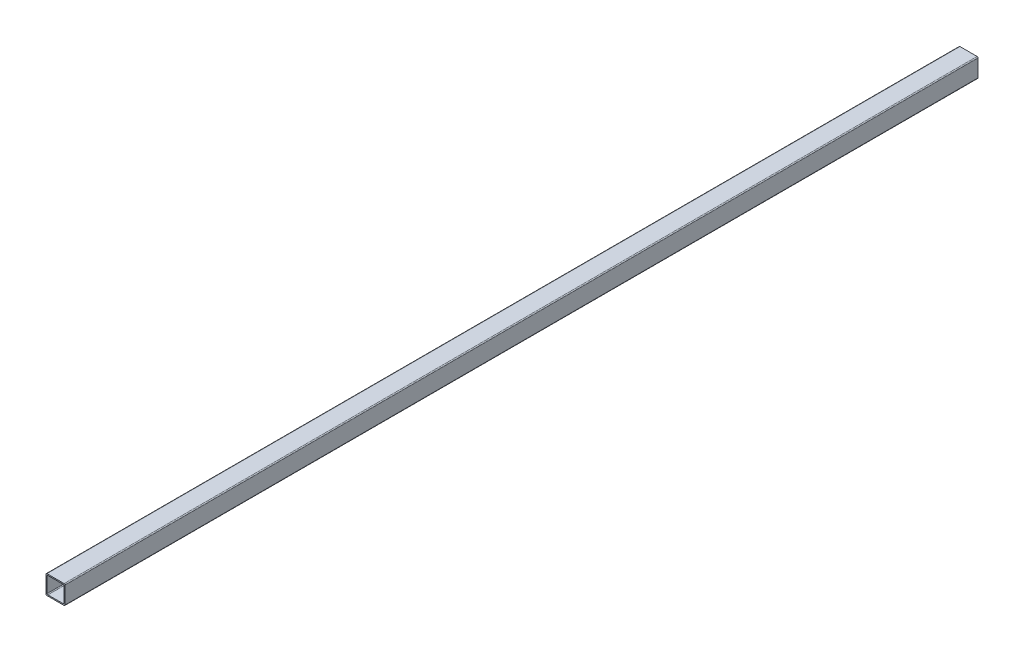
ISO-10303-21;
HEADER;
FILE_DESCRIPTION(('STEP AP214'),'2;1');
FILE_NAME('part.step','',(''),(''),'','','');
FILE_SCHEMA(('AUTOMOTIVE_DESIGN { 1 0 10303 214 1 1 1 1 }'));
ENDSEC;
DATA;
#1=APPLICATION_CONTEXT('core data for automotive mechanical design processes');
#2=APPLICATION_PROTOCOL_DEFINITION('international standard','automotive_design',2000,#1);
#3=PRODUCT_CONTEXT('',#1,'mechanical');
#4=PRODUCT('Part','Part','',(#3));
#5=PRODUCT_RELATED_PRODUCT_CATEGORY('part','',(#4));
#6=PRODUCT_DEFINITION_FORMATION('','',#4);
#7=PRODUCT_DEFINITION_CONTEXT('part definition',#1,'design');
#8=PRODUCT_DEFINITION('design','',#6,#7);
#9=PRODUCT_DEFINITION_SHAPE('','',#8);
#10=(LENGTH_UNIT() NAMED_UNIT(*) SI_UNIT(.MILLI.,.METRE.));
#11=(NAMED_UNIT(*) PLANE_ANGLE_UNIT() SI_UNIT($,.RADIAN.));
#12=(NAMED_UNIT(*) SI_UNIT($,.STERADIAN.) SOLID_ANGLE_UNIT());
#13=UNCERTAINTY_MEASURE_WITH_UNIT(LENGTH_MEASURE(1.E-05),#10,'distance_accuracy_value','');
#14=(GEOMETRIC_REPRESENTATION_CONTEXT(3) GLOBAL_UNCERTAINTY_ASSIGNED_CONTEXT((#13)) GLOBAL_UNIT_ASSIGNED_CONTEXT((#10,
#11,#12)) REPRESENTATION_CONTEXT('',''));
#15=CARTESIAN_POINT('',(0.,0.,0.));
#16=DIRECTION('',(0.,0.,1.));
#17=DIRECTION('',(1.,0.,0.));
#18=AXIS2_PLACEMENT_3D('',#15,#16,#17);
#19=CARTESIAN_POINT('',(22.86,-22.86,1219.2));
#20=DIRECTION('',(0.,0.,1.));
#21=DIRECTION('',(1.,0.,0.));
#22=AXIS2_PLACEMENT_3D('',#19,#20,#21);
#23=PLANE('',#22);
#24=CARTESIAN_POINT('',(22.86,-22.86,1219.2));
#25=DIRECTION('',(0.,0.,1.));
#26=DIRECTION('',(1.,0.,0.));
#27=AXIS2_PLACEMENT_3D('',#24,#25,#26);
#28=CIRCLE('',#27,2.54);
#29=CARTESIAN_POINT('',(22.86,-25.4,1219.2));
#30=VERTEX_POINT('',#29);
#31=CARTESIAN_POINT('',(25.4,-22.86,1219.2));
#32=VERTEX_POINT('',#31);
#33=EDGE_CURVE('E140',#30,#32,#28,.T.);
#34=ORIENTED_EDGE('',*,*,#33,.T.);
#35=DIRECTION('',(0.,1.,0.));
#36=VECTOR('',#35,1.);
#37=CARTESIAN_POINT('',(25.4,-22.86,1219.2));
#38=LINE('',#37,#36);
#39=CARTESIAN_POINT('',(25.4,22.86,1219.2));
#40=VERTEX_POINT('',#39);
#41=EDGE_CURVE('E223',#32,#40,#38,.T.);
#42=ORIENTED_EDGE('',*,*,#41,.T.);
#43=CARTESIAN_POINT('',(22.86,22.86,1219.2));
#44=DIRECTION('',(0.,0.,1.));
#45=DIRECTION('',(1.,0.,0.));
#46=AXIS2_PLACEMENT_3D('',#43,#44,#45);
#47=CIRCLE('',#46,2.54);
#48=CARTESIAN_POINT('',(22.86,25.4,1219.2));
#49=VERTEX_POINT('',#48);
#50=EDGE_CURVE('E225',#40,#49,#47,.T.);
#51=ORIENTED_EDGE('',*,*,#50,.T.);
#52=DIRECTION('',(-1.,0.,0.));
#53=VECTOR('',#52,1.);
#54=CARTESIAN_POINT('',(22.86,25.4,1219.2));
#55=LINE('',#54,#53);
#56=CARTESIAN_POINT('',(-22.86,25.4,1219.2));
#57=VERTEX_POINT('',#56);
#58=EDGE_CURVE('E227',#49,#57,#55,.T.);
#59=ORIENTED_EDGE('',*,*,#58,.T.);
#60=CARTESIAN_POINT('',(-22.86,22.86,1219.2));
#61=DIRECTION('',(0.,0.,1.));
#62=DIRECTION('',(1.,0.,0.));
#63=AXIS2_PLACEMENT_3D('',#60,#61,#62);
#64=CIRCLE('',#63,2.54);
#65=CARTESIAN_POINT('',(-25.4,22.86,1219.2));
#66=VERTEX_POINT('',#65);
#67=EDGE_CURVE('E229',#57,#66,#64,.T.);
#68=ORIENTED_EDGE('',*,*,#67,.T.);
#69=DIRECTION('',(0.,-1.,0.));
#70=VECTOR('',#69,1.);
#71=CARTESIAN_POINT('',(-25.4,-22.86,1219.2));
#72=LINE('',#71,#70);
#73=CARTESIAN_POINT('',(-25.4,-22.86,1219.2));
#74=VERTEX_POINT('',#73);
#75=EDGE_CURVE('E231',#66,#74,#72,.T.);
#76=ORIENTED_EDGE('',*,*,#75,.T.);
#77=CARTESIAN_POINT('',(-22.86,-22.86,1219.2));
#78=DIRECTION('',(0.,0.,1.));
#79=DIRECTION('',(1.,0.,0.));
#80=AXIS2_PLACEMENT_3D('',#77,#78,#79);
#81=CIRCLE('',#80,2.54);
#82=CARTESIAN_POINT('',(-22.86,-25.4,1219.2));
#83=VERTEX_POINT('',#82);
#84=EDGE_CURVE('E233',#74,#83,#81,.T.);
#85=ORIENTED_EDGE('',*,*,#84,.T.);
#86=DIRECTION('',(1.,0.,0.));
#87=VECTOR('',#86,1.);
#88=CARTESIAN_POINT('',(22.86,-25.4,1219.2));
#89=LINE('',#88,#87);
#90=EDGE_CURVE('E39',#83,#30,#89,.T.);
#91=ORIENTED_EDGE('',*,*,#90,.T.);
#92=EDGE_LOOP('',(#34,#42,#51,#59,#68,#76,#85,#91));
#93=FACE_BOUND('',#92,.T.);
#94=DIRECTION('',(-1.,0.,0.));
#95=VECTOR('',#94,1.);
#96=CARTESIAN_POINT('',(20.1168,22.352,1219.2));
#97=LINE('',#96,#95);
#98=CARTESIAN_POINT('',(20.1168,22.352,1219.2));
#99=VERTEX_POINT('',#98);
#100=CARTESIAN_POINT('',(-20.1168,22.352,1219.2));
#101=VERTEX_POINT('',#100);
#102=EDGE_CURVE('E196',#99,#101,#97,.T.);
#103=ORIENTED_EDGE('',*,*,#102,.F.);
#104=CARTESIAN_POINT('',(20.1168,20.1168,1219.2));
#105=DIRECTION('',(0.,0.,1.));
#106=DIRECTION('',(1.,0.,0.));
#107=AXIS2_PLACEMENT_3D('',#104,#105,#106);
#108=CIRCLE('',#107,2.2352);
#109=CARTESIAN_POINT('',(22.352,20.1168,1219.2));
#110=VERTEX_POINT('',#109);
#111=EDGE_CURVE('E137',#110,#99,#108,.T.);
#112=ORIENTED_EDGE('',*,*,#111,.F.);
#113=DIRECTION('',(0.,1.,0.));
#114=VECTOR('',#113,1.);
#115=CARTESIAN_POINT('',(22.352,20.1168,1219.2));
#116=LINE('',#115,#114);
#117=CARTESIAN_POINT('',(22.352,-20.1168,1219.2));
#118=VERTEX_POINT('',#117);
#119=EDGE_CURVE('E208',#118,#110,#116,.T.);
#120=ORIENTED_EDGE('',*,*,#119,.F.);
#121=CARTESIAN_POINT('',(20.1168,-20.1168,1219.2));
#122=DIRECTION('',(0.,0.,1.));
#123=DIRECTION('',(1.,0.,0.));
#124=AXIS2_PLACEMENT_3D('',#121,#122,#123);
#125=CIRCLE('',#124,2.2352);
#126=CARTESIAN_POINT('',(20.1168,-22.352,1219.2));
#127=VERTEX_POINT('',#126);
#128=EDGE_CURVE('E206',#127,#118,#125,.T.);
#129=ORIENTED_EDGE('',*,*,#128,.F.);
#130=DIRECTION('',(1.,0.,0.));
#131=VECTOR('',#130,1.);
#132=CARTESIAN_POINT('',(20.1168,-22.352,1219.2));
#133=LINE('',#132,#131);
#134=CARTESIAN_POINT('',(-20.1168,-22.352,1219.2));
#135=VERTEX_POINT('',#134);
#136=EDGE_CURVE('E204',#135,#127,#133,.T.);
#137=ORIENTED_EDGE('',*,*,#136,.F.);
#138=CARTESIAN_POINT('',(-20.1168,-20.1168,1219.2));
#139=DIRECTION('',(0.,0.,1.));
#140=DIRECTION('',(1.,0.,0.));
#141=AXIS2_PLACEMENT_3D('',#138,#139,#140);
#142=CIRCLE('',#141,2.2352);
#143=CARTESIAN_POINT('',(-22.352,-20.1168,1219.2));
#144=VERTEX_POINT('',#143);
#145=EDGE_CURVE('E202',#144,#135,#142,.T.);
#146=ORIENTED_EDGE('',*,*,#145,.F.);
#147=DIRECTION('',(0.,-1.,0.));
#148=VECTOR('',#147,1.);
#149=CARTESIAN_POINT('',(-22.352,20.1168,1219.2));
#150=LINE('',#149,#148);
#151=CARTESIAN_POINT('',(-22.352,20.1168,1219.2));
#152=VERTEX_POINT('',#151);
#153=EDGE_CURVE('E200',#152,#144,#150,.T.);
#154=ORIENTED_EDGE('',*,*,#153,.F.);
#155=CARTESIAN_POINT('',(-20.1168,20.1168,1219.2));
#156=DIRECTION('',(0.,0.,1.));
#157=DIRECTION('',(1.,0.,0.));
#158=AXIS2_PLACEMENT_3D('',#155,#156,#157);
#159=CIRCLE('',#158,2.2352);
#160=EDGE_CURVE('E198',#101,#152,#159,.T.);
#161=ORIENTED_EDGE('',*,*,#160,.F.);
#162=EDGE_LOOP('',(#103,#112,#120,#129,#137,#146,#154,#161));
#163=FACE_BOUND('',#162,.T.);
#164=ADVANCED_FACE('F16',(#93,#163),#23,.T.);
#165=CARTESIAN_POINT('',(22.86,-22.86,1219.2));
#166=DIRECTION('',(0.,0.,-1.));
#167=DIRECTION('',(-1.,0.,0.));
#168=AXIS2_PLACEMENT_3D('',#165,#166,#167);
#169=CYLINDRICAL_SURFACE('',#168,2.54);
#170=DIRECTION('',(0.,0.,-1.));
#171=VECTOR('',#170,1.);
#172=CARTESIAN_POINT('',(22.86,-25.4,1219.2));
#173=LINE('',#172,#171);
#174=CARTESIAN_POINT('',(22.86,-25.4,-1219.2));
#175=VERTEX_POINT('',#174);
#176=EDGE_CURVE('E236',#30,#175,#173,.T.);
#177=ORIENTED_EDGE('',*,*,#176,.T.);
#178=CARTESIAN_POINT('',(22.86,-22.86,-1219.2));
#179=DIRECTION('',(0.,0.,1.));
#180=DIRECTION('',(1.,0.,0.));
#181=AXIS2_PLACEMENT_3D('',#178,#179,#180);
#182=CIRCLE('',#181,2.54);
#183=CARTESIAN_POINT('',(25.4,-22.86,-1219.2));
#184=VERTEX_POINT('',#183);
#185=EDGE_CURVE('E171',#175,#184,#182,.T.);
#186=ORIENTED_EDGE('',*,*,#185,.T.);
#187=DIRECTION('',(0.,0.,-1.));
#188=VECTOR('',#187,1.);
#189=CARTESIAN_POINT('',(25.4,-22.86,1219.2));
#190=LINE('',#189,#188);
#191=EDGE_CURVE('E11',#32,#184,#190,.T.);
#192=ORIENTED_EDGE('',*,*,#191,.F.);
#193=ORIENTED_EDGE('',*,*,#33,.F.);
#194=EDGE_LOOP('',(#177,#186,#192,#193));
#195=FACE_BOUND('',#194,.T.);
#196=ADVANCED_FACE('F18',(#195),#169,.T.);
#197=CARTESIAN_POINT('',(25.4,-22.86,1219.2));
#198=DIRECTION('',(-1.,0.,0.));
#199=DIRECTION('',(0.,0.,1.));
#200=AXIS2_PLACEMENT_3D('',#197,#198,#199);
#201=PLANE('',#200);
#202=ORIENTED_EDGE('',*,*,#191,.T.);
#203=DIRECTION('',(0.,1.,0.));
#204=VECTOR('',#203,1.);
#205=CARTESIAN_POINT('',(25.4,-22.86,-1219.2));
#206=LINE('',#205,#204);
#207=CARTESIAN_POINT('',(25.4,22.86,-1219.2));
#208=VERTEX_POINT('',#207);
#209=EDGE_CURVE('E174',#184,#208,#206,.T.);
#210=ORIENTED_EDGE('',*,*,#209,.T.);
#211=DIRECTION('',(0.,0.,-1.));
#212=VECTOR('',#211,1.);
#213=CARTESIAN_POINT('',(25.4,22.86,1219.2));
#214=LINE('',#213,#212);
#215=EDGE_CURVE('E24',#40,#208,#214,.T.);
#216=ORIENTED_EDGE('',*,*,#215,.F.);
#217=ORIENTED_EDGE('',*,*,#41,.F.);
#218=EDGE_LOOP('',(#202,#210,#216,#217));
#219=FACE_BOUND('',#218,.T.);
#220=ADVANCED_FACE('F258',(#219),#201,.F.);
#221=CARTESIAN_POINT('',(22.86,22.86,1219.2));
#222=DIRECTION('',(0.,0.,-1.));
#223=DIRECTION('',(-1.,0.,0.));
#224=AXIS2_PLACEMENT_3D('',#221,#222,#223);
#225=CYLINDRICAL_SURFACE('',#224,2.54);
#226=ORIENTED_EDGE('',*,*,#215,.T.);
#227=CARTESIAN_POINT('',(22.86,22.86,-1219.2));
#228=DIRECTION('',(0.,0.,1.));
#229=DIRECTION('',(1.,0.,0.));
#230=AXIS2_PLACEMENT_3D('',#227,#228,#229);
#231=CIRCLE('',#230,2.54);
#232=CARTESIAN_POINT('',(22.86,25.4,-1219.2));
#233=VERTEX_POINT('',#232);
#234=EDGE_CURVE('E177',#208,#233,#231,.T.);
#235=ORIENTED_EDGE('',*,*,#234,.T.);
#236=DIRECTION('',(0.,0.,-1.));
#237=VECTOR('',#236,1.);
#238=CARTESIAN_POINT('',(22.86,25.4,1219.2));
#239=LINE('',#238,#237);
#240=EDGE_CURVE('E246',#49,#233,#239,.T.);
#241=ORIENTED_EDGE('',*,*,#240,.F.);
#242=ORIENTED_EDGE('',*,*,#50,.F.);
#243=EDGE_LOOP('',(#226,#235,#241,#242));
#244=FACE_BOUND('',#243,.T.);
#245=ADVANCED_FACE('F251',(#244),#225,.T.);
#246=CARTESIAN_POINT('',(22.86,25.4,1219.2));
#247=DIRECTION('',(0.,-1.,0.));
#248=DIRECTION('',(1.,0.,0.));
#249=AXIS2_PLACEMENT_3D('',#246,#247,#248);
#250=PLANE('',#249);
#251=ORIENTED_EDGE('',*,*,#240,.T.);
#252=DIRECTION('',(-1.,0.,0.));
#253=VECTOR('',#252,1.);
#254=CARTESIAN_POINT('',(22.86,25.4,-1219.2));
#255=LINE('',#254,#253);
#256=CARTESIAN_POINT('',(-22.86,25.4,-1219.2));
#257=VERTEX_POINT('',#256);
#258=EDGE_CURVE('E180',#233,#257,#255,.T.);
#259=ORIENTED_EDGE('',*,*,#258,.T.);
#260=DIRECTION('',(0.,0.,-1.));
#261=VECTOR('',#260,1.);
#262=CARTESIAN_POINT('',(-22.86,25.4,1219.2));
#263=LINE('',#262,#261);
#264=EDGE_CURVE('E244',#57,#257,#263,.T.);
#265=ORIENTED_EDGE('',*,*,#264,.F.);
#266=ORIENTED_EDGE('',*,*,#58,.F.);
#267=EDGE_LOOP('',(#251,#259,#265,#266));
#268=FACE_BOUND('',#267,.T.);
#269=ADVANCED_FACE('F281',(#268),#250,.F.);
#270=CARTESIAN_POINT('',(-22.86,22.86,1219.2));
#271=DIRECTION('',(0.,0.,-1.));
#272=DIRECTION('',(-1.,0.,0.));
#273=AXIS2_PLACEMENT_3D('',#270,#271,#272);
#274=CYLINDRICAL_SURFACE('',#273,2.54);
#275=ORIENTED_EDGE('',*,*,#264,.T.);
#276=CARTESIAN_POINT('',(-22.86,22.86,-1219.2));
#277=DIRECTION('',(0.,0.,1.));
#278=DIRECTION('',(1.,0.,0.));
#279=AXIS2_PLACEMENT_3D('',#276,#277,#278);
#280=CIRCLE('',#279,2.54);
#281=CARTESIAN_POINT('',(-25.4,22.86,-1219.2));
#282=VERTEX_POINT('',#281);
#283=EDGE_CURVE('E183',#257,#282,#280,.T.);
#284=ORIENTED_EDGE('',*,*,#283,.T.);
#285=DIRECTION('',(0.,0.,-1.));
#286=VECTOR('',#285,1.);
#287=CARTESIAN_POINT('',(-25.4,22.86,1219.2));
#288=LINE('',#287,#286);
#289=EDGE_CURVE('E242',#66,#282,#288,.T.);
#290=ORIENTED_EDGE('',*,*,#289,.F.);
#291=ORIENTED_EDGE('',*,*,#67,.F.);
#292=EDGE_LOOP('',(#275,#284,#290,#291));
#293=FACE_BOUND('',#292,.T.);
#294=ADVANCED_FACE('F278',(#293),#274,.T.);
#295=CARTESIAN_POINT('',(-25.4,-22.86,1219.2));
#296=DIRECTION('',(1.,0.,0.));
#297=DIRECTION('',(0.,0.,-1.));
#298=AXIS2_PLACEMENT_3D('',#295,#296,#297);
#299=PLANE('',#298);
#300=ORIENTED_EDGE('',*,*,#289,.T.);
#301=DIRECTION('',(0.,-1.,0.));
#302=VECTOR('',#301,1.);
#303=CARTESIAN_POINT('',(-25.4,-22.86,-1219.2));
#304=LINE('',#303,#302);
#305=CARTESIAN_POINT('',(-25.4,-22.86,-1219.2));
#306=VERTEX_POINT('',#305);
#307=EDGE_CURVE('E186',#282,#306,#304,.T.);
#308=ORIENTED_EDGE('',*,*,#307,.T.);
#309=DIRECTION('',(0.,0.,-1.));
#310=VECTOR('',#309,1.);
#311=CARTESIAN_POINT('',(-25.4,-22.86,1219.2));
#312=LINE('',#311,#310);
#313=EDGE_CURVE('E240',#74,#306,#312,.T.);
#314=ORIENTED_EDGE('',*,*,#313,.F.);
#315=ORIENTED_EDGE('',*,*,#75,.F.);
#316=EDGE_LOOP('',(#300,#308,#314,#315));
#317=FACE_BOUND('',#316,.T.);
#318=ADVANCED_FACE('F273',(#317),#299,.F.);
#319=CARTESIAN_POINT('',(-22.86,-22.86,1219.2));
#320=DIRECTION('',(0.,0.,-1.));
#321=DIRECTION('',(-1.,0.,0.));
#322=AXIS2_PLACEMENT_3D('',#319,#320,#321);
#323=CYLINDRICAL_SURFACE('',#322,2.54);
#324=ORIENTED_EDGE('',*,*,#313,.T.);
#325=CARTESIAN_POINT('',(-22.86,-22.86,-1219.2));
#326=DIRECTION('',(0.,0.,1.));
#327=DIRECTION('',(1.,0.,0.));
#328=AXIS2_PLACEMENT_3D('',#325,#326,#327);
#329=CIRCLE('',#328,2.54);
#330=CARTESIAN_POINT('',(-22.86,-25.4,-1219.2));
#331=VERTEX_POINT('',#330);
#332=EDGE_CURVE('E189',#306,#331,#329,.T.);
#333=ORIENTED_EDGE('',*,*,#332,.T.);
#334=DIRECTION('',(0.,0.,-1.));
#335=VECTOR('',#334,1.);
#336=CARTESIAN_POINT('',(-22.86,-25.4,1219.2));
#337=LINE('',#336,#335);
#338=EDGE_CURVE('E238',#83,#331,#337,.T.);
#339=ORIENTED_EDGE('',*,*,#338,.F.);
#340=ORIENTED_EDGE('',*,*,#84,.F.);
#341=EDGE_LOOP('',(#324,#333,#339,#340));
#342=FACE_BOUND('',#341,.T.);
#343=ADVANCED_FACE('F269',(#342),#323,.T.);
#344=CARTESIAN_POINT('',(22.86,-25.4,1219.2));
#345=DIRECTION('',(0.,1.,0.));
#346=DIRECTION('',(-1.,0.,0.));
#347=AXIS2_PLACEMENT_3D('',#344,#345,#346);
#348=PLANE('',#347);
#349=ORIENTED_EDGE('',*,*,#338,.T.);
#350=DIRECTION('',(1.,0.,0.));
#351=VECTOR('',#350,1.);
#352=CARTESIAN_POINT('',(22.86,-25.4,-1219.2));
#353=LINE('',#352,#351);
#354=EDGE_CURVE('E192',#331,#175,#353,.T.);
#355=ORIENTED_EDGE('',*,*,#354,.T.);
#356=ORIENTED_EDGE('',*,*,#176,.F.);
#357=ORIENTED_EDGE('',*,*,#90,.F.);
#358=EDGE_LOOP('',(#349,#355,#356,#357));
#359=FACE_BOUND('',#358,.T.);
#360=ADVANCED_FACE('F265',(#359),#348,.F.);
#361=CARTESIAN_POINT('',(20.1168,20.1168,1219.2));
#362=DIRECTION('',(0.,0.,-1.));
#363=DIRECTION('',(-1.,0.,0.));
#364=AXIS2_PLACEMENT_3D('',#361,#362,#363);
#365=CYLINDRICAL_SURFACE('',#364,2.2352);
#366=DIRECTION('',(0.,0.,-1.));
#367=VECTOR('',#366,1.);
#368=CARTESIAN_POINT('',(20.1168,22.352,1219.2));
#369=LINE('',#368,#367);
#370=CARTESIAN_POINT('',(20.1168,22.352,-1219.2));
#371=VERTEX_POINT('',#370);
#372=EDGE_CURVE('E129',#99,#371,#369,.T.);
#373=ORIENTED_EDGE('',*,*,#372,.T.);
#374=CARTESIAN_POINT('',(20.1168,20.1168,-1219.2));
#375=DIRECTION('',(0.,0.,1.));
#376=DIRECTION('',(1.,0.,0.));
#377=AXIS2_PLACEMENT_3D('',#374,#375,#376);
#378=CIRCLE('',#377,2.2352);
#379=CARTESIAN_POINT('',(22.352,20.1168,-1219.2));
#380=VERTEX_POINT('',#379);
#381=EDGE_CURVE('E134',#380,#371,#378,.T.);
#382=ORIENTED_EDGE('',*,*,#381,.F.);
#383=DIRECTION('',(0.,0.,-1.));
#384=VECTOR('',#383,1.);
#385=CARTESIAN_POINT('',(22.352,20.1168,1219.2));
#386=LINE('',#385,#384);
#387=EDGE_CURVE('E210',#110,#380,#386,.T.);
#388=ORIENTED_EDGE('',*,*,#387,.F.);
#389=ORIENTED_EDGE('',*,*,#111,.T.);
#390=EDGE_LOOP('',(#373,#382,#388,#389));
#391=FACE_BOUND('',#390,.T.);
#392=ADVANCED_FACE('F131',(#391),#365,.F.);
#393=CARTESIAN_POINT('',(20.1168,22.352,1219.2));
#394=DIRECTION('',(0.,-1.,0.));
#395=DIRECTION('',(0.,0.,-1.));
#396=AXIS2_PLACEMENT_3D('',#393,#394,#395);
#397=PLANE('',#396);
#398=DIRECTION('',(0.,0.,-1.));
#399=VECTOR('',#398,1.);
#400=CARTESIAN_POINT('',(-20.1168,22.352,1219.2));
#401=LINE('',#400,#399);
#402=CARTESIAN_POINT('',(-20.1168,22.352,-1219.2));
#403=VERTEX_POINT('',#402);
#404=EDGE_CURVE('E141',#101,#403,#401,.T.);
#405=ORIENTED_EDGE('',*,*,#404,.T.);
#406=DIRECTION('',(-1.,0.,0.));
#407=VECTOR('',#406,1.);
#408=CARTESIAN_POINT('',(20.1168,22.352,-1219.2));
#409=LINE('',#408,#407);
#410=EDGE_CURVE('E144',#371,#403,#409,.T.);
#411=ORIENTED_EDGE('',*,*,#410,.F.);
#412=ORIENTED_EDGE('',*,*,#372,.F.);
#413=ORIENTED_EDGE('',*,*,#102,.T.);
#414=EDGE_LOOP('',(#405,#411,#412,#413));
#415=FACE_BOUND('',#414,.T.);
#416=ADVANCED_FACE('F145',(#415),#397,.T.);
#417=CARTESIAN_POINT('',(-20.1168,20.1168,1219.2));
#418=DIRECTION('',(0.,0.,-1.));
#419=DIRECTION('',(-1.,0.,0.));
#420=AXIS2_PLACEMENT_3D('',#417,#418,#419);
#421=CYLINDRICAL_SURFACE('',#420,2.2352);
#422=DIRECTION('',(0.,0.,-1.));
#423=VECTOR('',#422,1.);
#424=CARTESIAN_POINT('',(-22.352,20.1168,1219.2));
#425=LINE('',#424,#423);
#426=CARTESIAN_POINT('',(-22.352,20.1168,-1219.2));
#427=VERTEX_POINT('',#426);
#428=EDGE_CURVE('E219',#152,#427,#425,.T.);
#429=ORIENTED_EDGE('',*,*,#428,.T.);
#430=CARTESIAN_POINT('',(-20.1168,20.1168,-1219.2));
#431=DIRECTION('',(0.,0.,1.));
#432=DIRECTION('',(1.,0.,0.));
#433=AXIS2_PLACEMENT_3D('',#430,#431,#432);
#434=CIRCLE('',#433,2.2352);
#435=EDGE_CURVE('E150',#403,#427,#434,.T.);
#436=ORIENTED_EDGE('',*,*,#435,.F.);
#437=ORIENTED_EDGE('',*,*,#404,.F.);
#438=ORIENTED_EDGE('',*,*,#160,.T.);
#439=EDGE_LOOP('',(#429,#436,#437,#438));
#440=FACE_BOUND('',#439,.T.);
#441=ADVANCED_FACE('F290',(#440),#421,.F.);
#442=CARTESIAN_POINT('',(-22.352,20.1168,1219.2));
#443=DIRECTION('',(1.,0.,0.));
#444=DIRECTION('',(0.,1.,0.));
#445=AXIS2_PLACEMENT_3D('',#442,#443,#444);
#446=PLANE('',#445);
#447=DIRECTION('',(0.,0.,-1.));
#448=VECTOR('',#447,1.);
#449=CARTESIAN_POINT('',(-22.352,-20.1168,1219.2));
#450=LINE('',#449,#448);
#451=CARTESIAN_POINT('',(-22.352,-20.1168,-1219.2));
#452=VERTEX_POINT('',#451);
#453=EDGE_CURVE('E217',#144,#452,#450,.T.);
#454=ORIENTED_EDGE('',*,*,#453,.T.);
#455=DIRECTION('',(0.,-1.,0.));
#456=VECTOR('',#455,1.);
#457=CARTESIAN_POINT('',(-22.352,20.1168,-1219.2));
#458=LINE('',#457,#456);
#459=EDGE_CURVE('E159',#427,#452,#458,.T.);
#460=ORIENTED_EDGE('',*,*,#459,.F.);
#461=ORIENTED_EDGE('',*,*,#428,.F.);
#462=ORIENTED_EDGE('',*,*,#153,.T.);
#463=EDGE_LOOP('',(#454,#460,#461,#462));
#464=FACE_BOUND('',#463,.T.);
#465=ADVANCED_FACE('F295',(#464),#446,.T.);
#466=CARTESIAN_POINT('',(-20.1168,-20.1168,1219.2));
#467=DIRECTION('',(0.,0.,-1.));
#468=DIRECTION('',(-1.,0.,0.));
#469=AXIS2_PLACEMENT_3D('',#466,#467,#468);
#470=CYLINDRICAL_SURFACE('',#469,2.2352);
#471=DIRECTION('',(0.,0.,-1.));
#472=VECTOR('',#471,1.);
#473=CARTESIAN_POINT('',(-20.1168,-22.352,1219.2));
#474=LINE('',#473,#472);
#475=CARTESIAN_POINT('',(-20.1168,-22.352,-1219.2));
#476=VERTEX_POINT('',#475);
#477=EDGE_CURVE('E215',#135,#476,#474,.T.);
#478=ORIENTED_EDGE('',*,*,#477,.T.);
#479=CARTESIAN_POINT('',(-20.1168,-20.1168,-1219.2));
#480=DIRECTION('',(0.,0.,1.));
#481=DIRECTION('',(1.,0.,0.));
#482=AXIS2_PLACEMENT_3D('',#479,#480,#481);
#483=CIRCLE('',#482,2.2352);
#484=EDGE_CURVE('E162',#452,#476,#483,.T.);
#485=ORIENTED_EDGE('',*,*,#484,.F.);
#486=ORIENTED_EDGE('',*,*,#453,.F.);
#487=ORIENTED_EDGE('',*,*,#145,.T.);
#488=EDGE_LOOP('',(#478,#485,#486,#487));
#489=FACE_BOUND('',#488,.T.);
#490=ADVANCED_FACE('F299',(#489),#470,.F.);
#491=CARTESIAN_POINT('',(20.1168,-22.352,1219.2));
#492=DIRECTION('',(0.,1.,0.));
#493=DIRECTION('',(-1.,0.,0.));
#494=AXIS2_PLACEMENT_3D('',#491,#492,#493);
#495=PLANE('',#494);
#496=DIRECTION('',(0.,0.,-1.));
#497=VECTOR('',#496,1.);
#498=CARTESIAN_POINT('',(20.1168,-22.352,1219.2));
#499=LINE('',#498,#497);
#500=CARTESIAN_POINT('',(20.1168,-22.352,-1219.2));
#501=VERTEX_POINT('',#500);
#502=EDGE_CURVE('E213',#127,#501,#499,.T.);
#503=ORIENTED_EDGE('',*,*,#502,.T.);
#504=DIRECTION('',(1.,0.,0.));
#505=VECTOR('',#504,1.);
#506=CARTESIAN_POINT('',(20.1168,-22.352,-1219.2));
#507=LINE('',#506,#505);
#508=EDGE_CURVE('E165',#476,#501,#507,.T.);
#509=ORIENTED_EDGE('',*,*,#508,.F.);
#510=ORIENTED_EDGE('',*,*,#477,.F.);
#511=ORIENTED_EDGE('',*,*,#136,.T.);
#512=EDGE_LOOP('',(#503,#509,#510,#511));
#513=FACE_BOUND('',#512,.T.);
#514=ADVANCED_FACE('F304',(#513),#495,.T.);
#515=CARTESIAN_POINT('',(20.1168,-20.1168,1219.2));
#516=DIRECTION('',(0.,0.,-1.));
#517=DIRECTION('',(-1.,0.,0.));
#518=AXIS2_PLACEMENT_3D('',#515,#516,#517);
#519=CYLINDRICAL_SURFACE('',#518,2.2352);
#520=DIRECTION('',(0.,0.,-1.));
#521=VECTOR('',#520,1.);
#522=CARTESIAN_POINT('',(22.352,-20.1168,1219.2));
#523=LINE('',#522,#521);
#524=CARTESIAN_POINT('',(22.352,-20.1168,-1219.2));
#525=VERTEX_POINT('',#524);
#526=EDGE_CURVE('E31',#118,#525,#523,.T.);
#527=ORIENTED_EDGE('',*,*,#526,.T.);
#528=CARTESIAN_POINT('',(20.1168,-20.1168,-1219.2));
#529=DIRECTION('',(0.,0.,1.));
#530=DIRECTION('',(1.,0.,0.));
#531=AXIS2_PLACEMENT_3D('',#528,#529,#530);
#532=CIRCLE('',#531,2.2352);
#533=EDGE_CURVE('E168',#501,#525,#532,.T.);
#534=ORIENTED_EDGE('',*,*,#533,.F.);
#535=ORIENTED_EDGE('',*,*,#502,.F.);
#536=ORIENTED_EDGE('',*,*,#128,.T.);
#537=EDGE_LOOP('',(#527,#534,#535,#536));
#538=FACE_BOUND('',#537,.T.);
#539=ADVANCED_FACE('F308',(#538),#519,.F.);
#540=CARTESIAN_POINT('',(22.352,20.1168,1219.2));
#541=DIRECTION('',(-1.,0.,0.));
#542=DIRECTION('',(0.,0.,1.));
#543=AXIS2_PLACEMENT_3D('',#540,#541,#542);
#544=PLANE('',#543);
#545=ORIENTED_EDGE('',*,*,#387,.T.);
#546=DIRECTION('',(0.,1.,0.));
#547=VECTOR('',#546,1.);
#548=CARTESIAN_POINT('',(22.352,20.1168,-1219.2));
#549=LINE('',#548,#547);
#550=EDGE_CURVE('E155',#525,#380,#549,.T.);
#551=ORIENTED_EDGE('',*,*,#550,.F.);
#552=ORIENTED_EDGE('',*,*,#526,.F.);
#553=ORIENTED_EDGE('',*,*,#119,.T.);
#554=EDGE_LOOP('',(#545,#551,#552,#553));
#555=FACE_BOUND('',#554,.T.);
#556=ADVANCED_FACE('F310',(#555),#544,.T.);
#557=CARTESIAN_POINT('',(22.86,-22.86,-1219.2));
#558=DIRECTION('',(0.,0.,1.));
#559=DIRECTION('',(1.,0.,0.));
#560=AXIS2_PLACEMENT_3D('',#557,#558,#559);
#561=PLANE('',#560);
#562=ORIENTED_EDGE('',*,*,#550,.T.);
#563=ORIENTED_EDGE('',*,*,#381,.T.);
#564=ORIENTED_EDGE('',*,*,#410,.T.);
#565=ORIENTED_EDGE('',*,*,#435,.T.);
#566=ORIENTED_EDGE('',*,*,#459,.T.);
#567=ORIENTED_EDGE('',*,*,#484,.T.);
#568=ORIENTED_EDGE('',*,*,#508,.T.);
#569=ORIENTED_EDGE('',*,*,#533,.T.);
#570=EDGE_LOOP('',(#562,#563,#564,#565,#566,#567,#568,#569));
#571=FACE_BOUND('',#570,.T.);
#572=ORIENTED_EDGE('',*,*,#185,.F.);
#573=ORIENTED_EDGE('',*,*,#354,.F.);
#574=ORIENTED_EDGE('',*,*,#332,.F.);
#575=ORIENTED_EDGE('',*,*,#307,.F.);
#576=ORIENTED_EDGE('',*,*,#283,.F.);
#577=ORIENTED_EDGE('',*,*,#258,.F.);
#578=ORIENTED_EDGE('',*,*,#234,.F.);
#579=ORIENTED_EDGE('',*,*,#209,.F.);
#580=EDGE_LOOP('',(#572,#573,#574,#575,#576,#577,#578,#579));
#581=FACE_BOUND('',#580,.T.);
#582=ADVANCED_FACE('F152',(#571,#581),#561,.F.);
#583=CLOSED_SHELL('',(#164,#196,#220,#245,#269,#294,#318,#343,#360,#392,#416,#441,#465,#490,
#514,#539,#556,#582));
#584=MANIFOLD_SOLID_BREP('B1',#583);
#585=ADVANCED_BREP_SHAPE_REPRESENTATION('',(#18,#584),#14);
#586=SHAPE_DEFINITION_REPRESENTATION(#9,#585);
ENDSEC;
END-ISO-10303-21;
